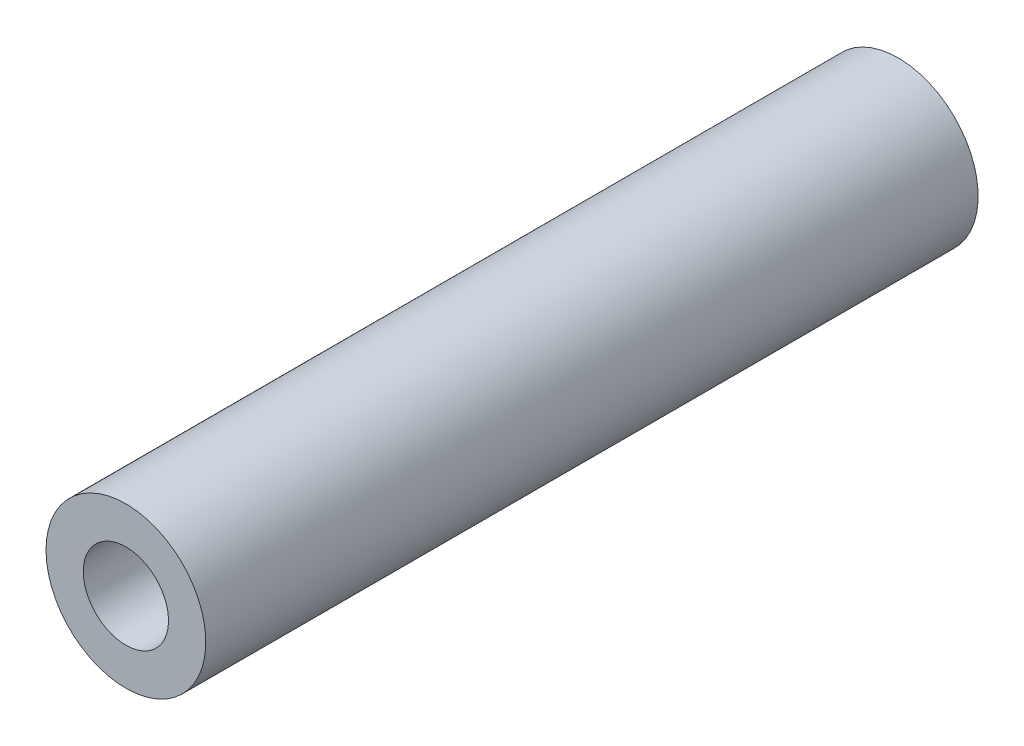
ISO-10303-21;
HEADER;
FILE_DESCRIPTION(('STEP AP214'),'2;1');
FILE_NAME('part.step','',(''),(''),'','','');
FILE_SCHEMA(('AUTOMOTIVE_DESIGN { 1 0 10303 214 1 1 1 1 }'));
ENDSEC;
DATA;
#1=APPLICATION_CONTEXT('core data for automotive mechanical design processes');
#2=APPLICATION_PROTOCOL_DEFINITION('international standard','automotive_design',2000,#1);
#3=PRODUCT_CONTEXT('',#1,'mechanical');
#4=PRODUCT('Part','Part','',(#3));
#5=PRODUCT_RELATED_PRODUCT_CATEGORY('part','',(#4));
#6=PRODUCT_DEFINITION_FORMATION('','',#4);
#7=PRODUCT_DEFINITION_CONTEXT('part definition',#1,'design');
#8=PRODUCT_DEFINITION('design','',#6,#7);
#9=PRODUCT_DEFINITION_SHAPE('','',#8);
#10=(LENGTH_UNIT() NAMED_UNIT(*) SI_UNIT(.MILLI.,.METRE.));
#11=(NAMED_UNIT(*) PLANE_ANGLE_UNIT() SI_UNIT($,.RADIAN.));
#12=(NAMED_UNIT(*) SI_UNIT($,.STERADIAN.) SOLID_ANGLE_UNIT());
#13=UNCERTAINTY_MEASURE_WITH_UNIT(LENGTH_MEASURE(1.E-05),#10,'distance_accuracy_value','');
#14=(GEOMETRIC_REPRESENTATION_CONTEXT(3) GLOBAL_UNCERTAINTY_ASSIGNED_CONTEXT((#13)) GLOBAL_UNIT_ASSIGNED_CONTEXT((#10,
#11,#12)) REPRESENTATION_CONTEXT('',''));
#15=CARTESIAN_POINT('',(0.,0.,0.));
#16=DIRECTION('',(0.,0.,1.));
#17=DIRECTION('',(1.,0.,0.));
#18=AXIS2_PLACEMENT_3D('',#15,#16,#17);
#19=CARTESIAN_POINT('',(0.,0.,58.));
#20=DIRECTION('',(0.,0.,1.));
#21=DIRECTION('',(1.,0.,0.));
#22=AXIS2_PLACEMENT_3D('',#19,#20,#21);
#23=PLANE('',#22);
#24=CARTESIAN_POINT('',(0.,0.,58.));
#25=DIRECTION('',(0.,0.,1.));
#26=DIRECTION('',(1.,0.,0.));
#27=AXIS2_PLACEMENT_3D('',#24,#25,#26);
#28=CIRCLE('',#27,6.);
#29=CARTESIAN_POINT('',(-6.,0.,58.));
#30=VERTEX_POINT('',#29);
#31=EDGE_CURVE('E10',#30,#30,#28,.T.);
#32=ORIENTED_EDGE('',*,*,#31,.T.);
#33=EDGE_LOOP('',(#32));
#34=FACE_BOUND('',#33,.T.);
#35=CARTESIAN_POINT('',(0.,0.,58.));
#36=DIRECTION('',(0.,0.,1.));
#37=DIRECTION('',(1.,0.,0.));
#38=AXIS2_PLACEMENT_3D('',#35,#36,#37);
#39=CIRCLE('',#38,3.2);
#40=CARTESIAN_POINT('',(-3.2,0.,58.));
#41=VERTEX_POINT('',#40);
#42=EDGE_CURVE('E48',#41,#41,#39,.T.);
#43=ORIENTED_EDGE('',*,*,#42,.F.);
#44=EDGE_LOOP('',(#43));
#45=FACE_BOUND('',#44,.T.);
#46=ADVANCED_FACE('F40',(#34,#45),#23,.T.);
#47=CARTESIAN_POINT('',(0.,0.,0.));
#48=DIRECTION('',(0.,0.,1.));
#49=DIRECTION('',(1.,0.,0.));
#50=AXIS2_PLACEMENT_3D('',#47,#48,#49);
#51=PLANE('',#50);
#52=CARTESIAN_POINT('',(0.,0.,0.));
#53=DIRECTION('',(0.,0.,1.));
#54=DIRECTION('',(1.,0.,0.));
#55=AXIS2_PLACEMENT_3D('',#52,#53,#54);
#56=CIRCLE('',#55,6.);
#57=CARTESIAN_POINT('',(-6.,0.,0.));
#58=VERTEX_POINT('',#57);
#59=EDGE_CURVE('E41',#58,#58,#56,.T.);
#60=ORIENTED_EDGE('',*,*,#59,.F.);
#61=EDGE_LOOP('',(#60));
#62=FACE_BOUND('',#61,.T.);
#63=CARTESIAN_POINT('',(0.,0.,0.));
#64=DIRECTION('',(0.,0.,1.));
#65=DIRECTION('',(1.,0.,0.));
#66=AXIS2_PLACEMENT_3D('',#63,#64,#65);
#67=CIRCLE('',#66,3.2);
#68=CARTESIAN_POINT('',(-3.2,0.,0.));
#69=VERTEX_POINT('',#68);
#70=EDGE_CURVE('E49',#69,#69,#67,.T.);
#71=ORIENTED_EDGE('',*,*,#70,.T.);
#72=EDGE_LOOP('',(#71));
#73=FACE_BOUND('',#72,.T.);
#74=ADVANCED_FACE('F58',(#62,#73),#51,.F.);
#75=CARTESIAN_POINT('',(0.,0.,58.));
#76=DIRECTION('',(0.,0.,-1.));
#77=DIRECTION('',(-1.,0.,0.));
#78=AXIS2_PLACEMENT_3D('',#75,#76,#77);
#79=CYLINDRICAL_SURFACE('',#78,6.);
#80=CARTESIAN_POINT('',(-6.,0.,58.));
#81=CARTESIAN_POINT('',(-6.,0.,57.3958333333333));
#82=CARTESIAN_POINT('',(-6.,0.,56.7916666666667));
#83=CARTESIAN_POINT('',(-6.,0.,55.5833333333333));
#84=CARTESIAN_POINT('',(-6.,0.,54.9791666666667));
#85=CARTESIAN_POINT('',(-6.,0.,53.7708333333333));
#86=CARTESIAN_POINT('',(-6.,0.,53.1666666666667));
#87=CARTESIAN_POINT('',(-6.,0.,51.9583333333333));
#88=CARTESIAN_POINT('',(-6.,0.,51.3541666666667));
#89=CARTESIAN_POINT('',(-6.,0.,50.1458333333333));
#90=CARTESIAN_POINT('',(-6.,0.,49.5416666666667));
#91=CARTESIAN_POINT('',(-6.,0.,48.3333333333333));
#92=CARTESIAN_POINT('',(-6.,0.,47.7291666666667));
#93=CARTESIAN_POINT('',(-6.,0.,46.5208333333333));
#94=CARTESIAN_POINT('',(-6.,0.,45.9166666666667));
#95=CARTESIAN_POINT('',(-6.,0.,44.7083333333333));
#96=CARTESIAN_POINT('',(-6.,0.,44.1041666666667));
#97=CARTESIAN_POINT('',(-6.,0.,42.8958333333333));
#98=CARTESIAN_POINT('',(-6.,0.,42.2916666666667));
#99=CARTESIAN_POINT('',(-6.,0.,41.0833333333333));
#100=CARTESIAN_POINT('',(-6.,0.,40.4791666666667));
#101=CARTESIAN_POINT('',(-6.,0.,39.2708333333333));
#102=CARTESIAN_POINT('',(-6.,0.,38.6666666666667));
#103=CARTESIAN_POINT('',(-6.,0.,37.4583333333333));
#104=CARTESIAN_POINT('',(-6.,0.,36.8541666666667));
#105=CARTESIAN_POINT('',(-6.,0.,35.6458333333333));
#106=CARTESIAN_POINT('',(-6.,0.,35.0416666666667));
#107=CARTESIAN_POINT('',(-6.,0.,33.8333333333333));
#108=CARTESIAN_POINT('',(-6.,0.,33.2291666666667));
#109=CARTESIAN_POINT('',(-6.,0.,32.0208333333333));
#110=CARTESIAN_POINT('',(-6.,0.,31.4166666666667));
#111=CARTESIAN_POINT('',(-6.,0.,30.2083333333333));
#112=CARTESIAN_POINT('',(-6.,0.,29.6041666666667));
#113=CARTESIAN_POINT('',(-6.,0.,28.3958333333333));
#114=CARTESIAN_POINT('',(-6.,0.,27.7916666666667));
#115=CARTESIAN_POINT('',(-6.,0.,26.5833333333333));
#116=CARTESIAN_POINT('',(-6.,0.,25.9791666666667));
#117=CARTESIAN_POINT('',(-6.,0.,24.7708333333333));
#118=CARTESIAN_POINT('',(-6.,0.,24.1666666666667));
#119=CARTESIAN_POINT('',(-6.,0.,22.9583333333333));
#120=CARTESIAN_POINT('',(-6.,0.,22.3541666666667));
#121=CARTESIAN_POINT('',(-6.,0.,21.1458333333333));
#122=CARTESIAN_POINT('',(-6.,0.,20.5416666666667));
#123=CARTESIAN_POINT('',(-6.,0.,19.3333333333333));
#124=CARTESIAN_POINT('',(-6.,0.,18.7291666666667));
#125=CARTESIAN_POINT('',(-6.,0.,17.5208333333333));
#126=CARTESIAN_POINT('',(-6.,0.,16.9166666666667));
#127=CARTESIAN_POINT('',(-6.,0.,15.7083333333333));
#128=CARTESIAN_POINT('',(-6.,0.,15.1041666666667));
#129=CARTESIAN_POINT('',(-6.,0.,13.8958333333333));
#130=CARTESIAN_POINT('',(-6.,0.,13.2916666666667));
#131=CARTESIAN_POINT('',(-6.,0.,12.0833333333333));
#132=CARTESIAN_POINT('',(-6.,0.,11.4791666666667));
#133=CARTESIAN_POINT('',(-6.,0.,10.2708333333333));
#134=CARTESIAN_POINT('',(-6.,0.,9.66666666666667));
#135=CARTESIAN_POINT('',(-6.,0.,8.45833333333333));
#136=CARTESIAN_POINT('',(-6.,0.,7.85416666666667));
#137=CARTESIAN_POINT('',(-6.,0.,6.64583333333333));
#138=CARTESIAN_POINT('',(-6.,0.,6.04166666666667));
#139=CARTESIAN_POINT('',(-6.,0.,4.83333333333333));
#140=CARTESIAN_POINT('',(-6.,0.,4.22916666666667));
#141=CARTESIAN_POINT('',(-6.,0.,3.02083333333334));
#142=CARTESIAN_POINT('',(-6.,0.,2.41666666666667));
#143=CARTESIAN_POINT('',(-6.,0.,1.20833333333333));
#144=CARTESIAN_POINT('',(-6.,0.,0.604166666666666));
#145=CARTESIAN_POINT('',(-6.,0.,0.));
#146=B_SPLINE_CURVE_WITH_KNOTS('',3,(#80,#81,#82,#83,#84,#85,#86,#87,#88,#89,#90,#91,#92,#93,
#94,#95,#96,#97,#98,#99,#100,#101,#102,#103,#104,#105,#106,#107,#108,#109,#110,#111,#112,#113,
#114,#115,#116,#117,#118,#119,#120,#121,#122,#123,#124,#125,#126,#127,#128,#129,#130,#131,#132,
#133,#134,#135,#136,#137,#138,#139,#140,#141,#142,#143,#144,#145),.UNSPECIFIED.,.F.,.F.,(4,2,2,
2,2,2,2,2,2,2,2,2,2,2,2,2,2,2,2,2,2,2,2,2,2,2,2,2,2,2,2,2,4),(0.,1.81249999999999,3.625,5.4375,
7.24999999999999,9.06249999999999,10.875,12.6875,14.5,16.3125,18.125,19.9375,21.75,23.5625,
25.375,27.1875,29.,30.8125,32.625,34.4375,36.25,38.0625,39.875,41.6875,43.5,45.3125,47.125,
48.9375,50.75,52.5625,54.375,56.1875,58.),.UNSPECIFIED.);
#147=EDGE_CURVE('BSEAM39',#30,#58,#146,.T.);
#148=ORIENTED_EDGE('',*,*,#31,.F.);
#149=ORIENTED_EDGE('',*,*,#59,.T.);
#150=ORIENTED_EDGE('',*,*,#147,.T.);
#151=ORIENTED_EDGE('',*,*,#147,.F.);
#152=EDGE_LOOP('',(#148,#150,#149,#151));
#153=FACE_BOUND('',#152,.T.);
#154=ADVANCED_FACE('F39',(#153),#79,.T.);
#155=CARTESIAN_POINT('',(0.,0.,58.));
#156=DIRECTION('',(0.,0.,-1.));
#157=DIRECTION('',(-1.,0.,0.));
#158=AXIS2_PLACEMENT_3D('',#155,#156,#157);
#159=CYLINDRICAL_SURFACE('',#158,3.2);
#160=CARTESIAN_POINT('',(-3.2,0.,58.));
#161=CARTESIAN_POINT('',(-3.2,0.,57.3958333333333));
#162=CARTESIAN_POINT('',(-3.2,0.,56.7916666666667));
#163=CARTESIAN_POINT('',(-3.2,0.,55.5833333333333));
#164=CARTESIAN_POINT('',(-3.2,0.,54.9791666666667));
#165=CARTESIAN_POINT('',(-3.2,0.,53.7708333333333));
#166=CARTESIAN_POINT('',(-3.2,0.,53.1666666666667));
#167=CARTESIAN_POINT('',(-3.2,0.,51.9583333333333));
#168=CARTESIAN_POINT('',(-3.2,0.,51.3541666666667));
#169=CARTESIAN_POINT('',(-3.2,0.,50.1458333333333));
#170=CARTESIAN_POINT('',(-3.2,0.,49.5416666666667));
#171=CARTESIAN_POINT('',(-3.2,0.,48.3333333333333));
#172=CARTESIAN_POINT('',(-3.2,0.,47.7291666666667));
#173=CARTESIAN_POINT('',(-3.2,0.,46.5208333333333));
#174=CARTESIAN_POINT('',(-3.2,0.,45.9166666666667));
#175=CARTESIAN_POINT('',(-3.2,0.,44.7083333333333));
#176=CARTESIAN_POINT('',(-3.2,0.,44.1041666666667));
#177=CARTESIAN_POINT('',(-3.2,0.,42.8958333333333));
#178=CARTESIAN_POINT('',(-3.2,0.,42.2916666666667));
#179=CARTESIAN_POINT('',(-3.2,0.,41.0833333333333));
#180=CARTESIAN_POINT('',(-3.2,0.,40.4791666666667));
#181=CARTESIAN_POINT('',(-3.2,0.,39.2708333333333));
#182=CARTESIAN_POINT('',(-3.2,0.,38.6666666666667));
#183=CARTESIAN_POINT('',(-3.2,0.,37.4583333333333));
#184=CARTESIAN_POINT('',(-3.2,0.,36.8541666666667));
#185=CARTESIAN_POINT('',(-3.2,0.,35.6458333333333));
#186=CARTESIAN_POINT('',(-3.2,0.,35.0416666666667));
#187=CARTESIAN_POINT('',(-3.2,0.,33.8333333333333));
#188=CARTESIAN_POINT('',(-3.2,0.,33.2291666666667));
#189=CARTESIAN_POINT('',(-3.2,0.,32.0208333333333));
#190=CARTESIAN_POINT('',(-3.2,0.,31.4166666666667));
#191=CARTESIAN_POINT('',(-3.2,0.,30.2083333333333));
#192=CARTESIAN_POINT('',(-3.2,0.,29.6041666666667));
#193=CARTESIAN_POINT('',(-3.2,0.,28.3958333333333));
#194=CARTESIAN_POINT('',(-3.2,0.,27.7916666666667));
#195=CARTESIAN_POINT('',(-3.2,0.,26.5833333333333));
#196=CARTESIAN_POINT('',(-3.2,0.,25.9791666666667));
#197=CARTESIAN_POINT('',(-3.2,0.,24.7708333333333));
#198=CARTESIAN_POINT('',(-3.2,0.,24.1666666666667));
#199=CARTESIAN_POINT('',(-3.2,0.,22.9583333333333));
#200=CARTESIAN_POINT('',(-3.2,0.,22.3541666666667));
#201=CARTESIAN_POINT('',(-3.2,0.,21.1458333333333));
#202=CARTESIAN_POINT('',(-3.2,0.,20.5416666666667));
#203=CARTESIAN_POINT('',(-3.2,0.,19.3333333333333));
#204=CARTESIAN_POINT('',(-3.2,0.,18.7291666666667));
#205=CARTESIAN_POINT('',(-3.2,0.,17.5208333333333));
#206=CARTESIAN_POINT('',(-3.2,0.,16.9166666666667));
#207=CARTESIAN_POINT('',(-3.2,0.,15.7083333333333));
#208=CARTESIAN_POINT('',(-3.2,0.,15.1041666666667));
#209=CARTESIAN_POINT('',(-3.2,0.,13.8958333333333));
#210=CARTESIAN_POINT('',(-3.2,0.,13.2916666666667));
#211=CARTESIAN_POINT('',(-3.2,0.,12.0833333333333));
#212=CARTESIAN_POINT('',(-3.2,0.,11.4791666666667));
#213=CARTESIAN_POINT('',(-3.2,0.,10.2708333333333));
#214=CARTESIAN_POINT('',(-3.2,0.,9.66666666666667));
#215=CARTESIAN_POINT('',(-3.2,0.,8.45833333333333));
#216=CARTESIAN_POINT('',(-3.2,0.,7.85416666666667));
#217=CARTESIAN_POINT('',(-3.2,0.,6.64583333333333));
#218=CARTESIAN_POINT('',(-3.2,0.,6.04166666666667));
#219=CARTESIAN_POINT('',(-3.2,0.,4.83333333333333));
#220=CARTESIAN_POINT('',(-3.2,0.,4.22916666666667));
#221=CARTESIAN_POINT('',(-3.2,0.,3.02083333333334));
#222=CARTESIAN_POINT('',(-3.2,0.,2.41666666666667));
#223=CARTESIAN_POINT('',(-3.2,0.,1.20833333333333));
#224=CARTESIAN_POINT('',(-3.2,0.,0.604166666666666));
#225=CARTESIAN_POINT('',(-3.2,0.,0.));
#226=B_SPLINE_CURVE_WITH_KNOTS('',3,(#160,#161,#162,#163,#164,#165,#166,#167,#168,#169,#170,
#171,#172,#173,#174,#175,#176,#177,#178,#179,#180,#181,#182,#183,#184,#185,#186,#187,#188,#189,
#190,#191,#192,#193,#194,#195,#196,#197,#198,#199,#200,#201,#202,#203,#204,#205,#206,#207,#208,
#209,#210,#211,#212,#213,#214,#215,#216,#217,#218,#219,#220,#221,#222,#223,#224,#225),
.UNSPECIFIED.,.F.,.F.,(4,2,2,2,2,2,2,2,2,2,2,2,2,2,2,2,2,2,2,2,2,2,2,2,2,2,2,2,2,2,2,2,4),(0.,
1.81249999999999,3.625,5.4375,7.24999999999999,9.06249999999999,10.875,12.6875,14.5,16.3125,
18.125,19.9375,21.75,23.5625,25.375,27.1875,29.,30.8125,32.625,34.4375,36.25,38.0625,39.875,
41.6875,43.5,45.3125,47.125,48.9375,50.75,52.5625,54.375,56.1875,58.),.UNSPECIFIED.);
#227=EDGE_CURVE('BSEAM57',#41,#69,#226,.T.);
#228=ORIENTED_EDGE('',*,*,#42,.T.);
#229=ORIENTED_EDGE('',*,*,#70,.F.);
#230=ORIENTED_EDGE('',*,*,#227,.T.);
#231=ORIENTED_EDGE('',*,*,#227,.F.);
#232=EDGE_LOOP('',(#228,#230,#229,#231));
#233=FACE_BOUND('',#232,.T.);
#234=ADVANCED_FACE('F57',(#233),#159,.F.);
#235=CLOSED_SHELL('',(#46,#74,#154,#234));
#236=MANIFOLD_SOLID_BREP('B2',#235);
#237=ADVANCED_BREP_SHAPE_REPRESENTATION('',(#18,#236),#14);
#238=SHAPE_DEFINITION_REPRESENTATION(#9,#237);
ENDSEC;
END-ISO-10303-21;
